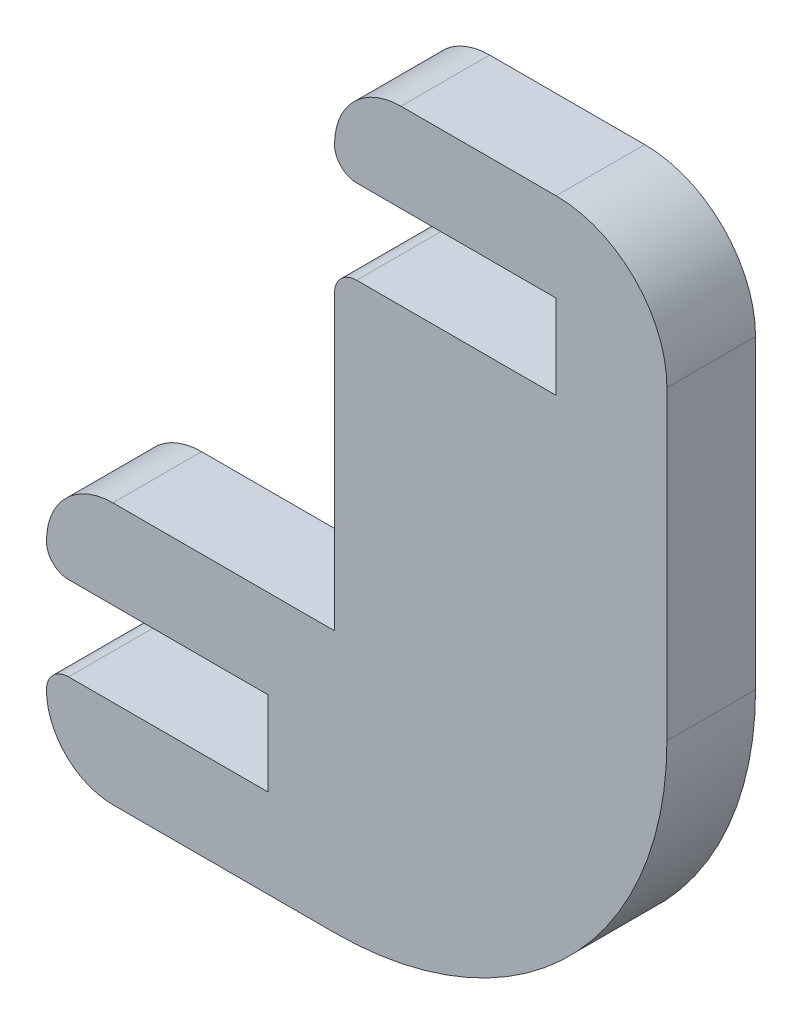
ISO-10303-21;
HEADER;
FILE_DESCRIPTION(('STEP AP214'),'2;1');
FILE_NAME('part.step','',(''),(''),'','','');
FILE_SCHEMA(('AUTOMOTIVE_DESIGN { 1 0 10303 214 1 1 1 1 }'));
ENDSEC;
DATA;
#1=APPLICATION_CONTEXT('core data for automotive mechanical design processes');
#2=APPLICATION_PROTOCOL_DEFINITION('international standard','automotive_design',2000,#1);
#3=PRODUCT_CONTEXT('',#1,'mechanical');
#4=PRODUCT('Part','Part','',(#3));
#5=PRODUCT_RELATED_PRODUCT_CATEGORY('part','',(#4));
#6=PRODUCT_DEFINITION_FORMATION('','',#4);
#7=PRODUCT_DEFINITION_CONTEXT('part definition',#1,'design');
#8=PRODUCT_DEFINITION('design','',#6,#7);
#9=PRODUCT_DEFINITION_SHAPE('','',#8);
#10=(LENGTH_UNIT() NAMED_UNIT(*) SI_UNIT(.MILLI.,.METRE.));
#11=(NAMED_UNIT(*) PLANE_ANGLE_UNIT() SI_UNIT($,.RADIAN.));
#12=(NAMED_UNIT(*) SI_UNIT($,.STERADIAN.) SOLID_ANGLE_UNIT());
#13=UNCERTAINTY_MEASURE_WITH_UNIT(LENGTH_MEASURE(1.E-05),#10,'distance_accuracy_value','');
#14=(GEOMETRIC_REPRESENTATION_CONTEXT(3) GLOBAL_UNCERTAINTY_ASSIGNED_CONTEXT((#13)) GLOBAL_UNIT_ASSIGNED_CONTEXT((#10,
#11,#12)) REPRESENTATION_CONTEXT('',''));
#15=CARTESIAN_POINT('',(0.,0.,0.));
#16=DIRECTION('',(0.,0.,1.));
#17=DIRECTION('',(1.,0.,0.));
#18=AXIS2_PLACEMENT_3D('',#15,#16,#17);
#19=CARTESIAN_POINT('',(-15.,29.8,4.));
#20=DIRECTION('',(0.,1.,0.));
#21=DIRECTION('',(-1.,0.,0.));
#22=AXIS2_PLACEMENT_3D('',#19,#20,#21);
#23=PLANE('',#22);
#24=DIRECTION('',(1.,0.,0.));
#25=VECTOR('',#24,1.);
#26=CARTESIAN_POINT('',(-15.,29.8,4.));
#27=LINE('',#26,#25);
#28=CARTESIAN_POINT('',(-14.,29.8,4.));
#29=VERTEX_POINT('',#28);
#30=CARTESIAN_POINT('',(-5.,29.8,4.));
#31=VERTEX_POINT('',#30);
#32=EDGE_CURVE('E170',#29,#31,#27,.T.);
#33=ORIENTED_EDGE('',*,*,#32,.F.);
#34=DIRECTION('',(0.,0.,-1.));
#35=VECTOR('',#34,1.);
#36=CARTESIAN_POINT('',(-14.,29.8,4.));
#37=LINE('',#36,#35);
#38=CARTESIAN_POINT('',(-14.,29.8,0.));
#39=VERTEX_POINT('',#38);
#40=EDGE_CURVE('E283',#29,#39,#37,.T.);
#41=ORIENTED_EDGE('',*,*,#40,.T.);
#42=DIRECTION('',(1.,0.,0.));
#43=VECTOR('',#42,1.);
#44=CARTESIAN_POINT('',(-15.,29.8,0.));
#45=LINE('',#44,#43);
#46=CARTESIAN_POINT('',(-5.,29.8,0.));
#47=VERTEX_POINT('',#46);
#48=EDGE_CURVE('E187',#39,#47,#45,.T.);
#49=ORIENTED_EDGE('',*,*,#48,.T.);
#50=DIRECTION('',(0.,0.,-1.));
#51=VECTOR('',#50,1.);
#52=CARTESIAN_POINT('',(-5.,29.8,4.));
#53=LINE('',#52,#51);
#54=EDGE_CURVE('E185',#31,#47,#53,.T.);
#55=ORIENTED_EDGE('',*,*,#54,.F.);
#56=EDGE_LOOP('',(#33,#41,#49,#55));
#57=FACE_BOUND('',#56,.T.);
#58=ADVANCED_FACE('F34',(#57),#23,.F.);
#59=CARTESIAN_POINT('',(-5.,29.8,4.));
#60=DIRECTION('',(1.,0.,0.));
#61=DIRECTION('',(0.,1.,0.));
#62=AXIS2_PLACEMENT_3D('',#59,#60,#61);
#63=PLANE('',#62);
#64=DIRECTION('',(0.,-1.,0.));
#65=VECTOR('',#64,1.);
#66=CARTESIAN_POINT('',(-5.,29.8,0.));
#67=LINE('',#66,#65);
#68=CARTESIAN_POINT('',(-5.,26.,0.));
#69=VERTEX_POINT('',#68);
#70=EDGE_CURVE('E220',#47,#69,#67,.T.);
#71=ORIENTED_EDGE('',*,*,#70,.T.);
#72=DIRECTION('',(0.,0.,-1.));
#73=VECTOR('',#72,1.);
#74=CARTESIAN_POINT('',(-5.,26.,4.));
#75=LINE('',#74,#73);
#76=CARTESIAN_POINT('',(-5.,26.,4.));
#77=VERTEX_POINT('',#76);
#78=EDGE_CURVE('E191',#77,#69,#75,.T.);
#79=ORIENTED_EDGE('',*,*,#78,.F.);
#80=DIRECTION('',(0.,-1.,0.));
#81=VECTOR('',#80,1.);
#82=CARTESIAN_POINT('',(-5.,29.8,4.));
#83=LINE('',#82,#81);
#84=EDGE_CURVE('E175',#31,#77,#83,.T.);
#85=ORIENTED_EDGE('',*,*,#84,.F.);
#86=ORIENTED_EDGE('',*,*,#54,.T.);
#87=EDGE_LOOP('',(#71,#79,#85,#86));
#88=FACE_BOUND('',#87,.T.);
#89=ADVANCED_FACE('F193',(#88),#63,.F.);
#90=CARTESIAN_POINT('',(-5.,26.,4.));
#91=DIRECTION('',(0.,-1.,0.));
#92=DIRECTION('',(0.,0.,-1.));
#93=AXIS2_PLACEMENT_3D('',#90,#91,#92);
#94=PLANE('',#93);
#95=DIRECTION('',(-1.,0.,0.));
#96=VECTOR('',#95,1.);
#97=CARTESIAN_POINT('',(-5.,26.,0.));
#98=LINE('',#97,#96);
#99=CARTESIAN_POINT('',(-14.,26.,0.));
#100=VERTEX_POINT('',#99);
#101=EDGE_CURVE('E222',#69,#100,#98,.T.);
#102=ORIENTED_EDGE('',*,*,#101,.T.);
#103=DIRECTION('',(0.,0.,-1.));
#104=VECTOR('',#103,1.);
#105=CARTESIAN_POINT('',(-14.,26.,4.));
#106=LINE('',#105,#104);
#107=CARTESIAN_POINT('',(-14.,26.,4.));
#108=VERTEX_POINT('',#107);
#109=EDGE_CURVE('E281',#100,#108,#106,.F.);
#110=ORIENTED_EDGE('',*,*,#109,.T.);
#111=DIRECTION('',(-1.,0.,0.));
#112=VECTOR('',#111,1.);
#113=CARTESIAN_POINT('',(-5.,26.,4.));
#114=LINE('',#113,#112);
#115=EDGE_CURVE('E196',#77,#108,#114,.T.);
#116=ORIENTED_EDGE('',*,*,#115,.F.);
#117=ORIENTED_EDGE('',*,*,#78,.T.);
#118=EDGE_LOOP('',(#102,#110,#116,#117));
#119=FACE_BOUND('',#118,.T.);
#120=ADVANCED_FACE('F348',(#119),#94,.F.);
#121=CARTESIAN_POINT('',(-15.,26.,4.));
#122=DIRECTION('',(1.,0.,0.));
#123=DIRECTION('',(0.,1.,0.));
#124=AXIS2_PLACEMENT_3D('',#121,#122,#123);
#125=PLANE('',#124);
#126=DIRECTION('',(0.,-1.,0.));
#127=VECTOR('',#126,1.);
#128=CARTESIAN_POINT('',(-15.,26.,4.));
#129=LINE('',#128,#127);
#130=CARTESIAN_POINT('',(-15.,25.,4.));
#131=VERTEX_POINT('',#130);
#132=CARTESIAN_POINT('',(-15.,11.8,4.));
#133=VERTEX_POINT('',#132);
#134=EDGE_CURVE('E198',#131,#133,#129,.T.);
#135=ORIENTED_EDGE('',*,*,#134,.F.);
#136=DIRECTION('',(0.,0.,-1.));
#137=VECTOR('',#136,1.);
#138=CARTESIAN_POINT('',(-15.,25.,4.));
#139=LINE('',#138,#137);
#140=CARTESIAN_POINT('',(-15.,25.,0.));
#141=VERTEX_POINT('',#140);
#142=EDGE_CURVE('E278',#131,#141,#139,.T.);
#143=ORIENTED_EDGE('',*,*,#142,.T.);
#144=DIRECTION('',(0.,-1.,0.));
#145=VECTOR('',#144,1.);
#146=CARTESIAN_POINT('',(-15.,26.,0.));
#147=LINE('',#146,#145);
#148=CARTESIAN_POINT('',(-15.,11.8,0.));
#149=VERTEX_POINT('',#148);
#150=EDGE_CURVE('E225',#141,#149,#147,.T.);
#151=ORIENTED_EDGE('',*,*,#150,.T.);
#152=DIRECTION('',(0.,0.,-1.));
#153=VECTOR('',#152,1.);
#154=CARTESIAN_POINT('',(-15.,11.8,4.));
#155=LINE('',#154,#153);
#156=EDGE_CURVE('E247',#133,#149,#155,.T.);
#157=ORIENTED_EDGE('',*,*,#156,.F.);
#158=EDGE_LOOP('',(#135,#143,#151,#157));
#159=FACE_BOUND('',#158,.T.);
#160=ADVANCED_FACE('F357',(#159),#125,.F.);
#161=CARTESIAN_POINT('',(-15.,11.8,4.));
#162=DIRECTION('',(0.,-1.,0.));
#163=DIRECTION('',(1.,0.,0.));
#164=AXIS2_PLACEMENT_3D('',#161,#162,#163);
#165=PLANE('',#164);
#166=DIRECTION('',(-1.,0.,0.));
#167=VECTOR('',#166,1.);
#168=CARTESIAN_POINT('',(-15.,11.8,0.));
#169=LINE('',#168,#167);
#170=CARTESIAN_POINT('',(-25.,11.8,0.));
#171=VERTEX_POINT('',#170);
#172=EDGE_CURVE('E227',#149,#171,#169,.T.);
#173=ORIENTED_EDGE('',*,*,#172,.T.);
#174=DIRECTION('',(0.,0.,-1.));
#175=VECTOR('',#174,1.);
#176=CARTESIAN_POINT('',(-25.,11.8,4.));
#177=LINE('',#176,#175);
#178=CARTESIAN_POINT('',(-25.,11.8,4.));
#179=VERTEX_POINT('',#178);
#180=EDGE_CURVE('E304',#171,#179,#177,.F.);
#181=ORIENTED_EDGE('',*,*,#180,.T.);
#182=DIRECTION('',(-1.,0.,0.));
#183=VECTOR('',#182,1.);
#184=CARTESIAN_POINT('',(-15.,11.8,4.));
#185=LINE('',#184,#183);
#186=EDGE_CURVE('E202',#133,#179,#185,.T.);
#187=ORIENTED_EDGE('',*,*,#186,.F.);
#188=ORIENTED_EDGE('',*,*,#156,.T.);
#189=EDGE_LOOP('',(#173,#181,#187,#188));
#190=FACE_BOUND('',#189,.T.);
#191=ADVANCED_FACE('F362',(#190),#165,.F.);
#192=CARTESIAN_POINT('',(-28.,7.8,4.));
#193=DIRECTION('',(0.,1.,0.));
#194=DIRECTION('',(0.,0.,1.));
#195=AXIS2_PLACEMENT_3D('',#192,#193,#194);
#196=PLANE('',#195);
#197=DIRECTION('',(1.,0.,0.));
#198=VECTOR('',#197,1.);
#199=CARTESIAN_POINT('',(-28.,7.8,4.));
#200=LINE('',#199,#198);
#201=CARTESIAN_POINT('',(-27.,7.8,4.));
#202=VERTEX_POINT('',#201);
#203=CARTESIAN_POINT('',(-18.,7.8,4.));
#204=VERTEX_POINT('',#203);
#205=EDGE_CURVE('E205',#202,#204,#200,.T.);
#206=ORIENTED_EDGE('',*,*,#205,.F.);
#207=DIRECTION('',(0.,0.,-1.));
#208=VECTOR('',#207,1.);
#209=CARTESIAN_POINT('',(-27.,7.8,4.));
#210=LINE('',#209,#208);
#211=CARTESIAN_POINT('',(-27.,7.8,0.));
#212=VERTEX_POINT('',#211);
#213=EDGE_CURVE('E272',#202,#212,#210,.T.);
#214=ORIENTED_EDGE('',*,*,#213,.T.);
#215=DIRECTION('',(1.,0.,0.));
#216=VECTOR('',#215,1.);
#217=CARTESIAN_POINT('',(-28.,7.8,0.));
#218=LINE('',#217,#216);
#219=CARTESIAN_POINT('',(-18.,7.8,0.));
#220=VERTEX_POINT('',#219);
#221=EDGE_CURVE('E230',#212,#220,#218,.T.);
#222=ORIENTED_EDGE('',*,*,#221,.T.);
#223=DIRECTION('',(0.,0.,-1.));
#224=VECTOR('',#223,1.);
#225=CARTESIAN_POINT('',(-18.,7.8,4.));
#226=LINE('',#225,#224);
#227=EDGE_CURVE('E244',#204,#220,#226,.T.);
#228=ORIENTED_EDGE('',*,*,#227,.F.);
#229=EDGE_LOOP('',(#206,#214,#222,#228));
#230=FACE_BOUND('',#229,.T.);
#231=ADVANCED_FACE('F375',(#230),#196,.F.);
#232=CARTESIAN_POINT('',(-18.,7.8,4.));
#233=DIRECTION('',(1.,0.,0.));
#234=DIRECTION('',(0.,1.,0.));
#235=AXIS2_PLACEMENT_3D('',#232,#233,#234);
#236=PLANE('',#235);
#237=DIRECTION('',(0.,-1.,0.));
#238=VECTOR('',#237,1.);
#239=CARTESIAN_POINT('',(-18.,7.8,0.));
#240=LINE('',#239,#238);
#241=CARTESIAN_POINT('',(-18.,4.,0.));
#242=VERTEX_POINT('',#241);
#243=EDGE_CURVE('E232',#220,#242,#240,.T.);
#244=ORIENTED_EDGE('',*,*,#243,.T.);
#245=DIRECTION('',(0.,0.,-1.));
#246=VECTOR('',#245,1.);
#247=CARTESIAN_POINT('',(-18.,4.,4.));
#248=LINE('',#247,#246);
#249=CARTESIAN_POINT('',(-18.,4.,4.));
#250=VERTEX_POINT('',#249);
#251=EDGE_CURVE('E218',#250,#242,#248,.T.);
#252=ORIENTED_EDGE('',*,*,#251,.F.);
#253=DIRECTION('',(0.,-1.,0.));
#254=VECTOR('',#253,1.);
#255=CARTESIAN_POINT('',(-18.,7.8,4.));
#256=LINE('',#255,#254);
#257=EDGE_CURVE('E207',#204,#250,#256,.T.);
#258=ORIENTED_EDGE('',*,*,#257,.F.);
#259=ORIENTED_EDGE('',*,*,#227,.T.);
#260=EDGE_LOOP('',(#244,#252,#258,#259));
#261=FACE_BOUND('',#260,.T.);
#262=ADVANCED_FACE('F381',(#261),#236,.F.);
#263=CARTESIAN_POINT('',(-18.,4.,4.));
#264=DIRECTION('',(0.,-1.,0.));
#265=DIRECTION('',(1.,0.,0.));
#266=AXIS2_PLACEMENT_3D('',#263,#264,#265);
#267=PLANE('',#266);
#268=DIRECTION('',(-1.,0.,0.));
#269=VECTOR('',#268,1.);
#270=CARTESIAN_POINT('',(-18.,4.,0.));
#271=LINE('',#270,#269);
#272=CARTESIAN_POINT('',(-27.,4.,0.));
#273=VERTEX_POINT('',#272);
#274=EDGE_CURVE('E234',#242,#273,#271,.T.);
#275=ORIENTED_EDGE('',*,*,#274,.T.);
#276=DIRECTION('',(0.,0.,-1.));
#277=VECTOR('',#276,1.);
#278=CARTESIAN_POINT('',(-27.,4.,4.));
#279=LINE('',#278,#277);
#280=CARTESIAN_POINT('',(-27.,4.,4.));
#281=VERTEX_POINT('',#280);
#282=EDGE_CURVE('E263',#273,#281,#279,.F.);
#283=ORIENTED_EDGE('',*,*,#282,.T.);
#284=DIRECTION('',(-1.,0.,0.));
#285=VECTOR('',#284,1.);
#286=CARTESIAN_POINT('',(-18.,4.,4.));
#287=LINE('',#286,#285);
#288=EDGE_CURVE('E209',#250,#281,#287,.T.);
#289=ORIENTED_EDGE('',*,*,#288,.F.);
#290=ORIENTED_EDGE('',*,*,#251,.T.);
#291=EDGE_LOOP('',(#275,#283,#289,#290));
#292=FACE_BOUND('',#291,.T.);
#293=ADVANCED_FACE('F385',(#292),#267,.F.);
#294=CARTESIAN_POINT('',(-28.,0.,4.));
#295=DIRECTION('',(0.,1.,0.));
#296=DIRECTION('',(0.,0.,1.));
#297=AXIS2_PLACEMENT_3D('',#294,#295,#296);
#298=PLANE('',#297);
#299=DIRECTION('',(1.,0.,0.));
#300=VECTOR('',#299,1.);
#301=CARTESIAN_POINT('',(-28.,0.,0.));
#302=LINE('',#301,#300);
#303=CARTESIAN_POINT('',(-25.,0.,0.));
#304=VERTEX_POINT('',#303);
#305=CARTESIAN_POINT('',(-15.,0.,0.));
#306=VERTEX_POINT('',#305);
#307=EDGE_CURVE('E237',#304,#306,#302,.T.);
#308=ORIENTED_EDGE('',*,*,#307,.T.);
#309=DIRECTION('',(0.,0.,-1.));
#310=VECTOR('',#309,1.);
#311=CARTESIAN_POINT('',(-15.,0.,4.));
#312=LINE('',#311,#310);
#313=CARTESIAN_POINT('',(-15.,0.,4.));
#314=VERTEX_POINT('',#313);
#315=EDGE_CURVE('E42',#306,#314,#312,.F.);
#316=ORIENTED_EDGE('',*,*,#315,.T.);
#317=DIRECTION('',(1.,0.,0.));
#318=VECTOR('',#317,1.);
#319=CARTESIAN_POINT('',(-28.,0.,4.));
#320=LINE('',#319,#318);
#321=CARTESIAN_POINT('',(-25.,0.,4.));
#322=VERTEX_POINT('',#321);
#323=EDGE_CURVE('E212',#322,#314,#320,.T.);
#324=ORIENTED_EDGE('',*,*,#323,.F.);
#325=DIRECTION('',(0.,0.,-1.));
#326=VECTOR('',#325,1.);
#327=CARTESIAN_POINT('',(-25.,0.,4.));
#328=LINE('',#327,#326);
#329=EDGE_CURVE('E288',#322,#304,#328,.T.);
#330=ORIENTED_EDGE('',*,*,#329,.T.);
#331=EDGE_LOOP('',(#308,#316,#324,#330));
#332=FACE_BOUND('',#331,.T.);
#333=ADVANCED_FACE('F396',(#332),#298,.F.);
#334=CARTESIAN_POINT('',(0.,33.8,4.));
#335=DIRECTION('',(-1.,0.,0.));
#336=DIRECTION('',(0.,0.,1.));
#337=AXIS2_PLACEMENT_3D('',#334,#335,#336);
#338=PLANE('',#337);
#339=DIRECTION('',(0.,1.,0.));
#340=VECTOR('',#339,1.);
#341=CARTESIAN_POINT('',(0.,33.8,4.));
#342=LINE('',#341,#340);
#343=CARTESIAN_POINT('',(0.,15.,4.));
#344=VERTEX_POINT('',#343);
#345=CARTESIAN_POINT('',(0.,28.8,4.));
#346=VERTEX_POINT('',#345);
#347=EDGE_CURVE('E214',#344,#346,#342,.T.);
#348=ORIENTED_EDGE('',*,*,#347,.F.);
#349=DIRECTION('',(0.,0.,-1.));
#350=VECTOR('',#349,1.);
#351=CARTESIAN_POINT('',(0.,15.,4.));
#352=LINE('',#351,#350);
#353=CARTESIAN_POINT('',(0.,15.,0.));
#354=VERTEX_POINT('',#353);
#355=EDGE_CURVE('E320',#344,#354,#352,.T.);
#356=ORIENTED_EDGE('',*,*,#355,.T.);
#357=DIRECTION('',(0.,1.,0.));
#358=VECTOR('',#357,1.);
#359=CARTESIAN_POINT('',(0.,33.8,0.));
#360=LINE('',#359,#358);
#361=CARTESIAN_POINT('',(0.,28.8,0.));
#362=VERTEX_POINT('',#361);
#363=EDGE_CURVE('E239',#354,#362,#360,.T.);
#364=ORIENTED_EDGE('',*,*,#363,.T.);
#365=DIRECTION('',(0.,0.,-1.));
#366=VECTOR('',#365,1.);
#367=CARTESIAN_POINT('',(0.,28.8,4.));
#368=LINE('',#367,#366);
#369=EDGE_CURVE('E315',#362,#346,#368,.F.);
#370=ORIENTED_EDGE('',*,*,#369,.T.);
#371=EDGE_LOOP('',(#348,#356,#364,#370));
#372=FACE_BOUND('',#371,.T.);
#373=ADVANCED_FACE('F326',(#372),#338,.F.);
#374=CARTESIAN_POINT('',(-15.,33.8,4.));
#375=DIRECTION('',(0.,-1.,0.));
#376=DIRECTION('',(0.,0.,-1.));
#377=AXIS2_PLACEMENT_3D('',#374,#375,#376);
#378=PLANE('',#377);
#379=DIRECTION('',(-1.,0.,0.));
#380=VECTOR('',#379,1.);
#381=CARTESIAN_POINT('',(-15.,33.8,4.));
#382=LINE('',#381,#380);
#383=CARTESIAN_POINT('',(-5.,33.8,4.));
#384=VERTEX_POINT('',#383);
#385=CARTESIAN_POINT('',(-12.,33.8,4.));
#386=VERTEX_POINT('',#385);
#387=EDGE_CURVE('E216',#384,#386,#382,.T.);
#388=ORIENTED_EDGE('',*,*,#387,.F.);
#389=DIRECTION('',(0.,0.,-1.));
#390=VECTOR('',#389,1.);
#391=CARTESIAN_POINT('',(-5.,33.8,4.));
#392=LINE('',#391,#390);
#393=CARTESIAN_POINT('',(-5.,33.8,0.));
#394=VERTEX_POINT('',#393);
#395=EDGE_CURVE('E309',#384,#394,#392,.T.);
#396=ORIENTED_EDGE('',*,*,#395,.T.);
#397=DIRECTION('',(-1.,0.,0.));
#398=VECTOR('',#397,1.);
#399=CARTESIAN_POINT('',(-15.,33.8,0.));
#400=LINE('',#399,#398);
#401=CARTESIAN_POINT('',(-12.,33.8,0.));
#402=VERTEX_POINT('',#401);
#403=EDGE_CURVE('E182',#394,#402,#400,.T.);
#404=ORIENTED_EDGE('',*,*,#403,.T.);
#405=DIRECTION('',(0.,0.,-1.));
#406=VECTOR('',#405,1.);
#407=CARTESIAN_POINT('',(-12.,33.8,4.));
#408=LINE('',#407,#406);
#409=EDGE_CURVE('E306',#402,#386,#408,.F.);
#410=ORIENTED_EDGE('',*,*,#409,.T.);
#411=EDGE_LOOP('',(#388,#396,#404,#410));
#412=FACE_BOUND('',#411,.T.);
#413=ADVANCED_FACE('F338',(#412),#378,.F.);
#414=CARTESIAN_POINT('',(0.,0.,4.));
#415=DIRECTION('',(0.,0.,1.));
#416=DIRECTION('',(1.,0.,0.));
#417=AXIS2_PLACEMENT_3D('',#414,#415,#416);
#418=PLANE('',#417);
#419=ORIENTED_EDGE('',*,*,#323,.T.);
#420=CARTESIAN_POINT('',(-15.,15.,4.));
#421=DIRECTION('',(0.,0.,1.));
#422=DIRECTION('',(1.,0.,0.));
#423=AXIS2_PLACEMENT_3D('',#420,#421,#422);
#424=CIRCLE('',#423,15.);
#425=EDGE_CURVE('E11',#314,#344,#424,.T.);
#426=ORIENTED_EDGE('',*,*,#425,.T.);
#427=ORIENTED_EDGE('',*,*,#347,.T.);
#428=CARTESIAN_POINT('',(-5.,28.8,4.));
#429=DIRECTION('',(0.,0.,1.));
#430=DIRECTION('',(1.,0.,0.));
#431=AXIS2_PLACEMENT_3D('',#428,#429,#430);
#432=CIRCLE('',#431,5.);
#433=EDGE_CURVE('E318',#346,#384,#432,.T.);
#434=ORIENTED_EDGE('',*,*,#433,.T.);
#435=ORIENTED_EDGE('',*,*,#387,.T.);
#436=CARTESIAN_POINT('',(-12.,30.8,4.));
#437=DIRECTION('',(0.,0.,1.));
#438=DIRECTION('',(1.,0.,0.));
#439=AXIS2_PLACEMENT_3D('',#436,#437,#438);
#440=CIRCLE('',#439,3.);
#441=CARTESIAN_POINT('',(-15.,30.8,4.));
#442=VERTEX_POINT('',#441);
#443=EDGE_CURVE('E298',#386,#442,#440,.T.);
#444=ORIENTED_EDGE('',*,*,#443,.T.);
#445=CARTESIAN_POINT('',(-14.,30.8,4.));
#446=DIRECTION('',(0.,0.,1.));
#447=DIRECTION('',(1.,0.,0.));
#448=AXIS2_PLACEMENT_3D('',#445,#446,#447);
#449=CIRCLE('',#448,1.);
#450=EDGE_CURVE('E178',#442,#29,#449,.T.);
#451=ORIENTED_EDGE('',*,*,#450,.T.);
#452=ORIENTED_EDGE('',*,*,#32,.T.);
#453=ORIENTED_EDGE('',*,*,#84,.T.);
#454=ORIENTED_EDGE('',*,*,#115,.T.);
#455=CARTESIAN_POINT('',(-14.,25.,4.));
#456=DIRECTION('',(0.,0.,1.));
#457=DIRECTION('',(1.,0.,0.));
#458=AXIS2_PLACEMENT_3D('',#455,#456,#457);
#459=CIRCLE('',#458,1.);
#460=EDGE_CURVE('E266',#108,#131,#459,.T.);
#461=ORIENTED_EDGE('',*,*,#460,.T.);
#462=ORIENTED_EDGE('',*,*,#134,.T.);
#463=ORIENTED_EDGE('',*,*,#186,.T.);
#464=CARTESIAN_POINT('',(-25.,8.8,4.));
#465=DIRECTION('',(0.,0.,1.));
#466=DIRECTION('',(1.,0.,0.));
#467=AXIS2_PLACEMENT_3D('',#464,#465,#466);
#468=CIRCLE('',#467,3.);
#469=CARTESIAN_POINT('',(-28.,8.8,4.));
#470=VERTEX_POINT('',#469);
#471=EDGE_CURVE('E300',#179,#470,#468,.T.);
#472=ORIENTED_EDGE('',*,*,#471,.T.);
#473=CARTESIAN_POINT('',(-27.,8.8,4.));
#474=DIRECTION('',(0.,0.,1.));
#475=DIRECTION('',(1.,0.,0.));
#476=AXIS2_PLACEMENT_3D('',#473,#474,#475);
#477=CIRCLE('',#476,1.);
#478=EDGE_CURVE('E268',#470,#202,#477,.T.);
#479=ORIENTED_EDGE('',*,*,#478,.T.);
#480=ORIENTED_EDGE('',*,*,#205,.T.);
#481=ORIENTED_EDGE('',*,*,#257,.T.);
#482=ORIENTED_EDGE('',*,*,#288,.T.);
#483=CARTESIAN_POINT('',(-27.,3.,4.));
#484=DIRECTION('',(0.,0.,1.));
#485=DIRECTION('',(1.,0.,0.));
#486=AXIS2_PLACEMENT_3D('',#483,#484,#485);
#487=CIRCLE('',#486,1.);
#488=CARTESIAN_POINT('',(-28.,3.,4.));
#489=VERTEX_POINT('',#488);
#490=EDGE_CURVE('E270',#281,#489,#487,.T.);
#491=ORIENTED_EDGE('',*,*,#490,.T.);
#492=CARTESIAN_POINT('',(-25.,3.,4.));
#493=DIRECTION('',(0.,0.,1.));
#494=DIRECTION('',(1.,0.,0.));
#495=AXIS2_PLACEMENT_3D('',#492,#493,#494);
#496=CIRCLE('',#495,3.);
#497=EDGE_CURVE('E302',#489,#322,#496,.T.);
#498=ORIENTED_EDGE('',*,*,#497,.T.);
#499=EDGE_LOOP('',(#419,#426,#427,#434,#435,#444,#451,#452,#453,#454,#461,#462,#463,#472,#479,
#480,#481,#482,#491,#498));
#500=FACE_BOUND('',#499,.T.);
#501=ADVANCED_FACE('F172',(#500),#418,.T.);
#502=CARTESIAN_POINT('',(0.,0.,0.));
#503=DIRECTION('',(0.,0.,1.));
#504=DIRECTION('',(1.,0.,0.));
#505=AXIS2_PLACEMENT_3D('',#502,#503,#504);
#506=PLANE('',#505);
#507=ORIENTED_EDGE('',*,*,#363,.F.);
#508=CARTESIAN_POINT('',(-15.,15.,0.));
#509=DIRECTION('',(0.,0.,1.));
#510=DIRECTION('',(1.,0.,0.));
#511=AXIS2_PLACEMENT_3D('',#508,#509,#510);
#512=CIRCLE('',#511,15.);
#513=EDGE_CURVE('E56',#354,#306,#512,.F.);
#514=ORIENTED_EDGE('',*,*,#513,.T.);
#515=ORIENTED_EDGE('',*,*,#307,.F.);
#516=CARTESIAN_POINT('',(-25.,3.,0.));
#517=DIRECTION('',(0.,0.,1.));
#518=DIRECTION('',(1.,0.,0.));
#519=AXIS2_PLACEMENT_3D('',#516,#517,#518);
#520=CIRCLE('',#519,3.);
#521=CARTESIAN_POINT('',(-28.,3.,0.));
#522=VERTEX_POINT('',#521);
#523=EDGE_CURVE('E296',#304,#522,#520,.F.);
#524=ORIENTED_EDGE('',*,*,#523,.T.);
#525=CARTESIAN_POINT('',(-27.,3.,0.));
#526=DIRECTION('',(0.,0.,1.));
#527=DIRECTION('',(1.,0.,0.));
#528=AXIS2_PLACEMENT_3D('',#525,#526,#527);
#529=CIRCLE('',#528,1.);
#530=EDGE_CURVE('E261',#522,#273,#529,.F.);
#531=ORIENTED_EDGE('',*,*,#530,.T.);
#532=ORIENTED_EDGE('',*,*,#274,.F.);
#533=ORIENTED_EDGE('',*,*,#243,.F.);
#534=ORIENTED_EDGE('',*,*,#221,.F.);
#535=CARTESIAN_POINT('',(-27.,8.8,0.));
#536=DIRECTION('',(0.,0.,1.));
#537=DIRECTION('',(1.,0.,0.));
#538=AXIS2_PLACEMENT_3D('',#535,#536,#537);
#539=CIRCLE('',#538,1.);
#540=CARTESIAN_POINT('',(-28.,8.8,0.));
#541=VERTEX_POINT('',#540);
#542=EDGE_CURVE('E258',#212,#541,#539,.F.);
#543=ORIENTED_EDGE('',*,*,#542,.T.);
#544=CARTESIAN_POINT('',(-25.,8.8,0.));
#545=DIRECTION('',(0.,0.,1.));
#546=DIRECTION('',(1.,0.,0.));
#547=AXIS2_PLACEMENT_3D('',#544,#545,#546);
#548=CIRCLE('',#547,3.);
#549=EDGE_CURVE('E294',#541,#171,#548,.F.);
#550=ORIENTED_EDGE('',*,*,#549,.T.);
#551=ORIENTED_EDGE('',*,*,#172,.F.);
#552=ORIENTED_EDGE('',*,*,#150,.F.);
#553=CARTESIAN_POINT('',(-14.,25.,0.));
#554=DIRECTION('',(0.,0.,1.));
#555=DIRECTION('',(1.,0.,0.));
#556=AXIS2_PLACEMENT_3D('',#553,#554,#555);
#557=CIRCLE('',#556,1.);
#558=EDGE_CURVE('E256',#141,#100,#557,.F.);
#559=ORIENTED_EDGE('',*,*,#558,.T.);
#560=ORIENTED_EDGE('',*,*,#101,.F.);
#561=ORIENTED_EDGE('',*,*,#70,.F.);
#562=ORIENTED_EDGE('',*,*,#48,.F.);
#563=CARTESIAN_POINT('',(-14.,30.8,0.));
#564=DIRECTION('',(0.,0.,1.));
#565=DIRECTION('',(1.,0.,0.));
#566=AXIS2_PLACEMENT_3D('',#563,#564,#565);
#567=CIRCLE('',#566,1.);
#568=CARTESIAN_POINT('',(-15.,30.8,0.));
#569=VERTEX_POINT('',#568);
#570=EDGE_CURVE('E253',#39,#569,#567,.F.);
#571=ORIENTED_EDGE('',*,*,#570,.T.);
#572=CARTESIAN_POINT('',(-12.,30.8,0.));
#573=DIRECTION('',(0.,0.,1.));
#574=DIRECTION('',(1.,0.,0.));
#575=AXIS2_PLACEMENT_3D('',#572,#573,#574);
#576=CIRCLE('',#575,3.);
#577=EDGE_CURVE('E291',#569,#402,#576,.F.);
#578=ORIENTED_EDGE('',*,*,#577,.T.);
#579=ORIENTED_EDGE('',*,*,#403,.F.);
#580=CARTESIAN_POINT('',(-5.,28.8,0.));
#581=DIRECTION('',(0.,0.,1.));
#582=DIRECTION('',(1.,0.,0.));
#583=AXIS2_PLACEMENT_3D('',#580,#581,#582);
#584=CIRCLE('',#583,5.);
#585=EDGE_CURVE('E312',#394,#362,#584,.F.);
#586=ORIENTED_EDGE('',*,*,#585,.T.);
#587=EDGE_LOOP('',(#507,#514,#515,#524,#531,#532,#533,#534,#543,#550,#551,#552,#559,#560,#561,
#562,#571,#578,#579,#586));
#588=FACE_BOUND('',#587,.T.);
#589=ADVANCED_FACE('F329',(#588),#506,.F.);
#590=CARTESIAN_POINT('',(-27.,3.,4.));
#591=DIRECTION('',(0.,0.,-1.));
#592=DIRECTION('',(-1.,0.,0.));
#593=AXIS2_PLACEMENT_3D('',#590,#591,#592);
#594=CYLINDRICAL_SURFACE('',#593,1.);
#595=ORIENTED_EDGE('',*,*,#490,.F.);
#596=ORIENTED_EDGE('',*,*,#282,.F.);
#597=ORIENTED_EDGE('',*,*,#530,.F.);
#598=DIRECTION('',(0.,0.,-1.));
#599=VECTOR('',#598,1.);
#600=CARTESIAN_POINT('',(-28.,3.,4.));
#601=LINE('',#600,#599);
#602=EDGE_CURVE('E190',#489,#522,#601,.T.);
#603=ORIENTED_EDGE('',*,*,#602,.F.);
#604=EDGE_LOOP('',(#595,#596,#597,#603));
#605=FACE_BOUND('',#604,.T.);
#606=ADVANCED_FACE('F390',(#605),#594,.T.);
#607=CARTESIAN_POINT('',(-27.,8.8,4.));
#608=DIRECTION('',(0.,0.,-1.));
#609=DIRECTION('',(-1.,0.,0.));
#610=AXIS2_PLACEMENT_3D('',#607,#608,#609);
#611=CYLINDRICAL_SURFACE('',#610,1.);
#612=ORIENTED_EDGE('',*,*,#478,.F.);
#613=DIRECTION('',(0.,0.,-1.));
#614=VECTOR('',#613,1.);
#615=CARTESIAN_POINT('',(-28.,8.8,4.));
#616=LINE('',#615,#614);
#617=EDGE_CURVE('E275',#541,#470,#616,.F.);
#618=ORIENTED_EDGE('',*,*,#617,.F.);
#619=ORIENTED_EDGE('',*,*,#542,.F.);
#620=ORIENTED_EDGE('',*,*,#213,.F.);
#621=EDGE_LOOP('',(#612,#618,#619,#620));
#622=FACE_BOUND('',#621,.T.);
#623=ADVANCED_FACE('F372',(#622),#611,.T.);
#624=CARTESIAN_POINT('',(-14.,25.,4.));
#625=DIRECTION('',(0.,0.,-1.));
#626=DIRECTION('',(-1.,0.,0.));
#627=AXIS2_PLACEMENT_3D('',#624,#625,#626);
#628=CYLINDRICAL_SURFACE('',#627,1.);
#629=ORIENTED_EDGE('',*,*,#460,.F.);
#630=ORIENTED_EDGE('',*,*,#109,.F.);
#631=ORIENTED_EDGE('',*,*,#558,.F.);
#632=ORIENTED_EDGE('',*,*,#142,.F.);
#633=EDGE_LOOP('',(#629,#630,#631,#632));
#634=FACE_BOUND('',#633,.T.);
#635=ADVANCED_FACE('F354',(#634),#628,.T.);
#636=CARTESIAN_POINT('',(-14.,30.8,4.));
#637=DIRECTION('',(0.,0.,-1.));
#638=DIRECTION('',(-1.,0.,0.));
#639=AXIS2_PLACEMENT_3D('',#636,#637,#638);
#640=CYLINDRICAL_SURFACE('',#639,1.);
#641=ORIENTED_EDGE('',*,*,#450,.F.);
#642=DIRECTION('',(0.,0.,-1.));
#643=VECTOR('',#642,1.);
#644=CARTESIAN_POINT('',(-15.,30.8,4.));
#645=LINE('',#644,#643);
#646=EDGE_CURVE('E285',#569,#442,#645,.F.);
#647=ORIENTED_EDGE('',*,*,#646,.F.);
#648=ORIENTED_EDGE('',*,*,#570,.F.);
#649=ORIENTED_EDGE('',*,*,#40,.F.);
#650=EDGE_LOOP('',(#641,#647,#648,#649));
#651=FACE_BOUND('',#650,.T.);
#652=ADVANCED_FACE('F345',(#651),#640,.T.);
#653=CARTESIAN_POINT('',(-25.,3.,4.));
#654=DIRECTION('',(0.,0.,-1.));
#655=DIRECTION('',(-1.,0.,0.));
#656=AXIS2_PLACEMENT_3D('',#653,#654,#655);
#657=CYLINDRICAL_SURFACE('',#656,3.);
#658=ORIENTED_EDGE('',*,*,#497,.F.);
#659=ORIENTED_EDGE('',*,*,#602,.T.);
#660=ORIENTED_EDGE('',*,*,#523,.F.);
#661=ORIENTED_EDGE('',*,*,#329,.F.);
#662=EDGE_LOOP('',(#658,#659,#660,#661));
#663=FACE_BOUND('',#662,.T.);
#664=ADVANCED_FACE('F395',(#663),#657,.T.);
#665=CARTESIAN_POINT('',(-25.,8.8,4.));
#666=DIRECTION('',(0.,0.,-1.));
#667=DIRECTION('',(-1.,0.,0.));
#668=AXIS2_PLACEMENT_3D('',#665,#666,#667);
#669=CYLINDRICAL_SURFACE('',#668,3.);
#670=ORIENTED_EDGE('',*,*,#471,.F.);
#671=ORIENTED_EDGE('',*,*,#180,.F.);
#672=ORIENTED_EDGE('',*,*,#549,.F.);
#673=ORIENTED_EDGE('',*,*,#617,.T.);
#674=EDGE_LOOP('',(#670,#671,#672,#673));
#675=FACE_BOUND('',#674,.T.);
#676=ADVANCED_FACE('F366',(#675),#669,.T.);
#677=CARTESIAN_POINT('',(-12.,30.8,4.));
#678=DIRECTION('',(0.,0.,-1.));
#679=DIRECTION('',(-1.,0.,0.));
#680=AXIS2_PLACEMENT_3D('',#677,#678,#679);
#681=CYLINDRICAL_SURFACE('',#680,3.);
#682=ORIENTED_EDGE('',*,*,#443,.F.);
#683=ORIENTED_EDGE('',*,*,#409,.F.);
#684=ORIENTED_EDGE('',*,*,#577,.F.);
#685=ORIENTED_EDGE('',*,*,#646,.T.);
#686=EDGE_LOOP('',(#682,#683,#684,#685));
#687=FACE_BOUND('',#686,.T.);
#688=ADVANCED_FACE('F342',(#687),#681,.T.);
#689=CARTESIAN_POINT('',(-5.,28.8,4.));
#690=DIRECTION('',(0.,0.,-1.));
#691=DIRECTION('',(-1.,0.,0.));
#692=AXIS2_PLACEMENT_3D('',#689,#690,#691);
#693=CYLINDRICAL_SURFACE('',#692,5.);
#694=ORIENTED_EDGE('',*,*,#433,.F.);
#695=ORIENTED_EDGE('',*,*,#369,.F.);
#696=ORIENTED_EDGE('',*,*,#585,.F.);
#697=ORIENTED_EDGE('',*,*,#395,.F.);
#698=EDGE_LOOP('',(#694,#695,#696,#697));
#699=FACE_BOUND('',#698,.T.);
#700=ADVANCED_FACE('F335',(#699),#693,.T.);
#701=CARTESIAN_POINT('',(-15.,15.,4.));
#702=DIRECTION('',(0.,0.,-1.));
#703=DIRECTION('',(-1.,0.,0.));
#704=AXIS2_PLACEMENT_3D('',#701,#702,#703);
#705=CYLINDRICAL_SURFACE('',#704,15.);
#706=ORIENTED_EDGE('',*,*,#425,.F.);
#707=ORIENTED_EDGE('',*,*,#315,.F.);
#708=ORIENTED_EDGE('',*,*,#513,.F.);
#709=ORIENTED_EDGE('',*,*,#355,.F.);
#710=EDGE_LOOP('',(#706,#707,#708,#709));
#711=FACE_BOUND('',#710,.T.);
#712=ADVANCED_FACE('F36',(#711),#705,.T.);
#713=CLOSED_SHELL('',(#58,#89,#120,#160,#191,#231,#262,#293,#333,#373,#413,#501,#589,#606,#623,
#635,#652,#664,#676,#688,#700,#712));
#714=MANIFOLD_SOLID_BREP('B2',#713);
#715=ADVANCED_BREP_SHAPE_REPRESENTATION('',(#18,#714),#14);
#716=SHAPE_DEFINITION_REPRESENTATION(#9,#715);
ENDSEC;
END-ISO-10303-21;
